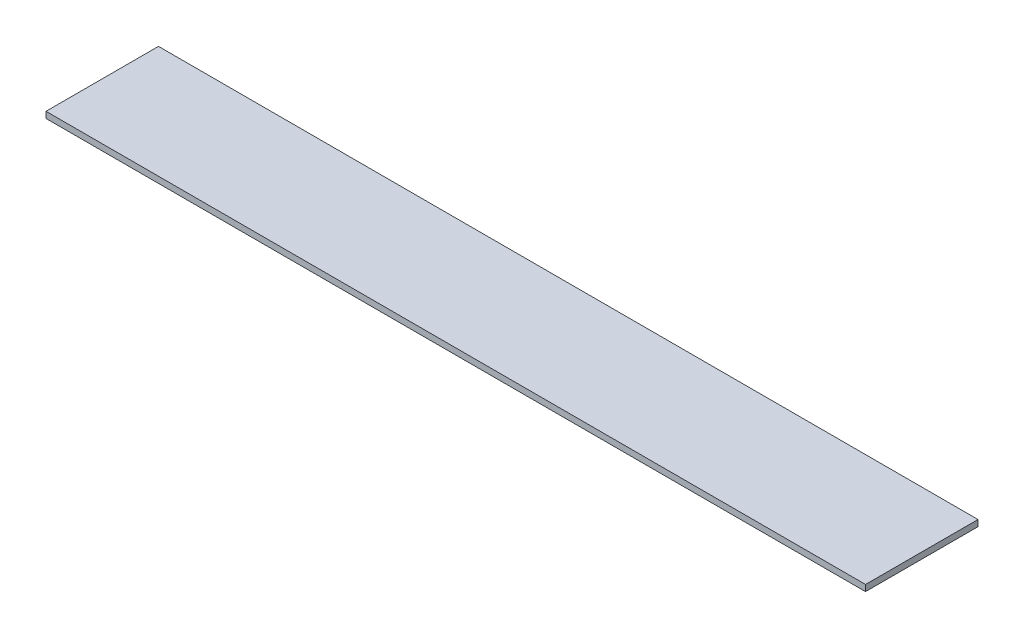
ISO-10303-21;
HEADER;
FILE_DESCRIPTION(('STEP AP214'),'2;1');
FILE_NAME('part.step','',(''),(''),'','','');
FILE_SCHEMA(('AUTOMOTIVE_DESIGN { 1 0 10303 214 1 1 1 1 }'));
ENDSEC;
DATA;
#1=APPLICATION_CONTEXT('core data for automotive mechanical design processes');
#2=APPLICATION_PROTOCOL_DEFINITION('international standard','automotive_design',2000,#1);
#3=PRODUCT_CONTEXT('',#1,'mechanical');
#4=PRODUCT('Part','Part','',(#3));
#5=PRODUCT_RELATED_PRODUCT_CATEGORY('part','',(#4));
#6=PRODUCT_DEFINITION_FORMATION('','',#4);
#7=PRODUCT_DEFINITION_CONTEXT('part definition',#1,'design');
#8=PRODUCT_DEFINITION('design','',#6,#7);
#9=PRODUCT_DEFINITION_SHAPE('','',#8);
#10=(LENGTH_UNIT() NAMED_UNIT(*) SI_UNIT(.MILLI.,.METRE.));
#11=(NAMED_UNIT(*) PLANE_ANGLE_UNIT() SI_UNIT($,.RADIAN.));
#12=(NAMED_UNIT(*) SI_UNIT($,.STERADIAN.) SOLID_ANGLE_UNIT());
#13=UNCERTAINTY_MEASURE_WITH_UNIT(LENGTH_MEASURE(1.E-05),#10,'distance_accuracy_value','');
#14=(GEOMETRIC_REPRESENTATION_CONTEXT(3) GLOBAL_UNCERTAINTY_ASSIGNED_CONTEXT((#13)) GLOBAL_UNIT_ASSIGNED_CONTEXT((#10,
#11,#12)) REPRESENTATION_CONTEXT('',''));
#15=CARTESIAN_POINT('',(0.,0.,0.));
#16=DIRECTION('',(0.,0.,1.));
#17=DIRECTION('',(1.,0.,0.));
#18=AXIS2_PLACEMENT_3D('',#15,#16,#17);
#19=CARTESIAN_POINT('',(-199.64989399683,3.175,-39.3901250037282));
#20=DIRECTION('',(1.,0.,0.));
#21=DIRECTION('',(0.,0.,-1.));
#22=AXIS2_PLACEMENT_3D('',#19,#20,#21);
#23=PLANE('',#22);
#24=DIRECTION('',(0.,0.,1.));
#25=VECTOR('',#24,1.);
#26=CARTESIAN_POINT('',(-199.64989399683,0.,-39.3901250037282));
#27=LINE('',#26,#25);
#28=CARTESIAN_POINT('',(-199.64989399683,0.,-39.3901250037282));
#29=VERTEX_POINT('',#28);
#30=CARTESIAN_POINT('',(-199.64989399683,0.,17.9098749962659));
#31=VERTEX_POINT('',#30);
#32=EDGE_CURVE('E99',#29,#31,#27,.T.);
#33=ORIENTED_EDGE('',*,*,#32,.T.);
#34=DIRECTION('',(0.,-1.,0.));
#35=VECTOR('',#34,1.);
#36=CARTESIAN_POINT('',(-199.64989399683,3.175,17.9098749962659));
#37=LINE('',#36,#35);
#38=CARTESIAN_POINT('',(-199.64989399683,3.175,17.9098749962659));
#39=VERTEX_POINT('',#38);
#40=EDGE_CURVE('E11',#39,#31,#37,.T.);
#41=ORIENTED_EDGE('',*,*,#40,.F.);
#42=DIRECTION('',(0.,0.,1.));
#43=VECTOR('',#42,1.);
#44=CARTESIAN_POINT('',(-199.64989399683,3.175,-39.3901250037282));
#45=LINE('',#44,#43);
#46=CARTESIAN_POINT('',(-199.64989399683,3.175,-39.3901250037282));
#47=VERTEX_POINT('',#46);
#48=EDGE_CURVE('E87',#47,#39,#45,.T.);
#49=ORIENTED_EDGE('',*,*,#48,.F.);
#50=DIRECTION('',(0.,-1.,0.));
#51=VECTOR('',#50,1.);
#52=CARTESIAN_POINT('',(-199.64989399683,3.175,-39.3901250037282));
#53=LINE('',#52,#51);
#54=EDGE_CURVE('E95',#47,#29,#53,.T.);
#55=ORIENTED_EDGE('',*,*,#54,.T.);
#56=EDGE_LOOP('',(#33,#41,#49,#55));
#57=FACE_BOUND('',#56,.T.);
#58=ADVANCED_FACE('F36',(#57),#23,.F.);
#59=CARTESIAN_POINT('',(-199.64989399683,3.175,17.9098749962659));
#60=DIRECTION('',(0.,0.,-1.));
#61=DIRECTION('',(-1.,0.,0.));
#62=AXIS2_PLACEMENT_3D('',#59,#60,#61);
#63=PLANE('',#62);
#64=DIRECTION('',(1.,0.,0.));
#65=VECTOR('',#64,1.);
#66=CARTESIAN_POINT('',(-199.64989399683,0.,17.9098749962659));
#67=LINE('',#66,#65);
#68=CARTESIAN_POINT('',(217.865146003158,0.,17.9098749962659));
#69=VERTEX_POINT('',#68);
#70=EDGE_CURVE('E91',#31,#69,#67,.T.);
#71=ORIENTED_EDGE('',*,*,#70,.T.);
#72=DIRECTION('',(0.,-1.,0.));
#73=VECTOR('',#72,1.);
#74=CARTESIAN_POINT('',(217.865146003158,3.175,17.9098749962659));
#75=LINE('',#74,#73);
#76=CARTESIAN_POINT('',(217.865146003158,3.175,17.9098749962659));
#77=VERTEX_POINT('',#76);
#78=EDGE_CURVE('E44',#77,#69,#75,.T.);
#79=ORIENTED_EDGE('',*,*,#78,.F.);
#80=DIRECTION('',(1.,0.,0.));
#81=VECTOR('',#80,1.);
#82=CARTESIAN_POINT('',(-199.64989399683,3.175,17.9098749962659));
#83=LINE('',#82,#81);
#84=EDGE_CURVE('E82',#39,#77,#83,.T.);
#85=ORIENTED_EDGE('',*,*,#84,.F.);
#86=ORIENTED_EDGE('',*,*,#40,.T.);
#87=EDGE_LOOP('',(#71,#79,#85,#86));
#88=FACE_BOUND('',#87,.T.);
#89=ADVANCED_FACE('F90',(#88),#63,.F.);
#90=CARTESIAN_POINT('',(217.865146003158,3.175,-39.3901250037282));
#91=DIRECTION('',(-1.,0.,0.));
#92=DIRECTION('',(0.,0.,1.));
#93=AXIS2_PLACEMENT_3D('',#90,#91,#92);
#94=PLANE('',#93);
#95=DIRECTION('',(0.,0.,-1.));
#96=VECTOR('',#95,1.);
#97=CARTESIAN_POINT('',(217.865146003158,0.,-39.3901250037282));
#98=LINE('',#97,#96);
#99=CARTESIAN_POINT('',(217.865146003158,0.,-39.3901250037282));
#100=VERTEX_POINT('',#99);
#101=EDGE_CURVE('E69',#69,#100,#98,.T.);
#102=ORIENTED_EDGE('',*,*,#101,.T.);
#103=DIRECTION('',(0.,-1.,0.));
#104=VECTOR('',#103,1.);
#105=CARTESIAN_POINT('',(217.865146003158,3.175,-39.3901250037282));
#106=LINE('',#105,#104);
#107=CARTESIAN_POINT('',(217.865146003158,3.175,-39.3901250037282));
#108=VERTEX_POINT('',#107);
#109=EDGE_CURVE('E92',#108,#100,#106,.T.);
#110=ORIENTED_EDGE('',*,*,#109,.F.);
#111=DIRECTION('',(0.,0.,-1.));
#112=VECTOR('',#111,1.);
#113=CARTESIAN_POINT('',(217.865146003158,3.175,-39.3901250037282));
#114=LINE('',#113,#112);
#115=EDGE_CURVE('E85',#77,#108,#114,.T.);
#116=ORIENTED_EDGE('',*,*,#115,.F.);
#117=ORIENTED_EDGE('',*,*,#78,.T.);
#118=EDGE_LOOP('',(#102,#110,#116,#117));
#119=FACE_BOUND('',#118,.T.);
#120=ADVANCED_FACE('F93',(#119),#94,.F.);
#121=CARTESIAN_POINT('',(-199.64989399683,3.175,-39.3901250037282));
#122=DIRECTION('',(0.,0.,1.));
#123=DIRECTION('',(1.,0.,0.));
#124=AXIS2_PLACEMENT_3D('',#121,#122,#123);
#125=PLANE('',#124);
#126=DIRECTION('',(-1.,0.,0.));
#127=VECTOR('',#126,1.);
#128=CARTESIAN_POINT('',(-199.64989399683,0.,-39.3901250037282));
#129=LINE('',#128,#127);
#130=EDGE_CURVE('E75',#100,#29,#129,.T.);
#131=ORIENTED_EDGE('',*,*,#130,.T.);
#132=ORIENTED_EDGE('',*,*,#54,.F.);
#133=DIRECTION('',(-1.,0.,0.));
#134=VECTOR('',#133,1.);
#135=CARTESIAN_POINT('',(-199.64989399683,3.175,-39.3901250037282));
#136=LINE('',#135,#134);
#137=EDGE_CURVE('E52',#108,#47,#136,.T.);
#138=ORIENTED_EDGE('',*,*,#137,.F.);
#139=ORIENTED_EDGE('',*,*,#109,.T.);
#140=EDGE_LOOP('',(#131,#132,#138,#139));
#141=FACE_BOUND('',#140,.T.);
#142=ADVANCED_FACE('F106',(#141),#125,.F.);
#143=CARTESIAN_POINT('',(0.,3.175,0.));
#144=DIRECTION('',(0.,1.,0.));
#145=DIRECTION('',(0.,0.,1.));
#146=AXIS2_PLACEMENT_3D('',#143,#144,#145);
#147=PLANE('',#146);
#148=ORIENTED_EDGE('',*,*,#48,.T.);
#149=ORIENTED_EDGE('',*,*,#84,.T.);
#150=ORIENTED_EDGE('',*,*,#115,.T.);
#151=ORIENTED_EDGE('',*,*,#137,.T.);
#152=EDGE_LOOP('',(#148,#149,#150,#151));
#153=FACE_BOUND('',#152,.T.);
#154=ADVANCED_FACE('F83',(#153),#147,.T.);
#155=CARTESIAN_POINT('',(0.,0.,0.));
#156=DIRECTION('',(0.,1.,0.));
#157=DIRECTION('',(0.,0.,1.));
#158=AXIS2_PLACEMENT_3D('',#155,#156,#157);
#159=PLANE('',#158);
#160=ORIENTED_EDGE('',*,*,#32,.F.);
#161=ORIENTED_EDGE('',*,*,#130,.F.);
#162=ORIENTED_EDGE('',*,*,#101,.F.);
#163=ORIENTED_EDGE('',*,*,#70,.F.);
#164=EDGE_LOOP('',(#160,#161,#162,#163));
#165=FACE_BOUND('',#164,.T.);
#166=ADVANCED_FACE('F109',(#165),#159,.F.);
#167=CLOSED_SHELL('',(#58,#89,#120,#142,#154,#166));
#168=MANIFOLD_SOLID_BREP('B2',#167);
#169=ADVANCED_BREP_SHAPE_REPRESENTATION('',(#18,#168),#14);
#170=SHAPE_DEFINITION_REPRESENTATION(#9,#169);
ENDSEC;
END-ISO-10303-21;
